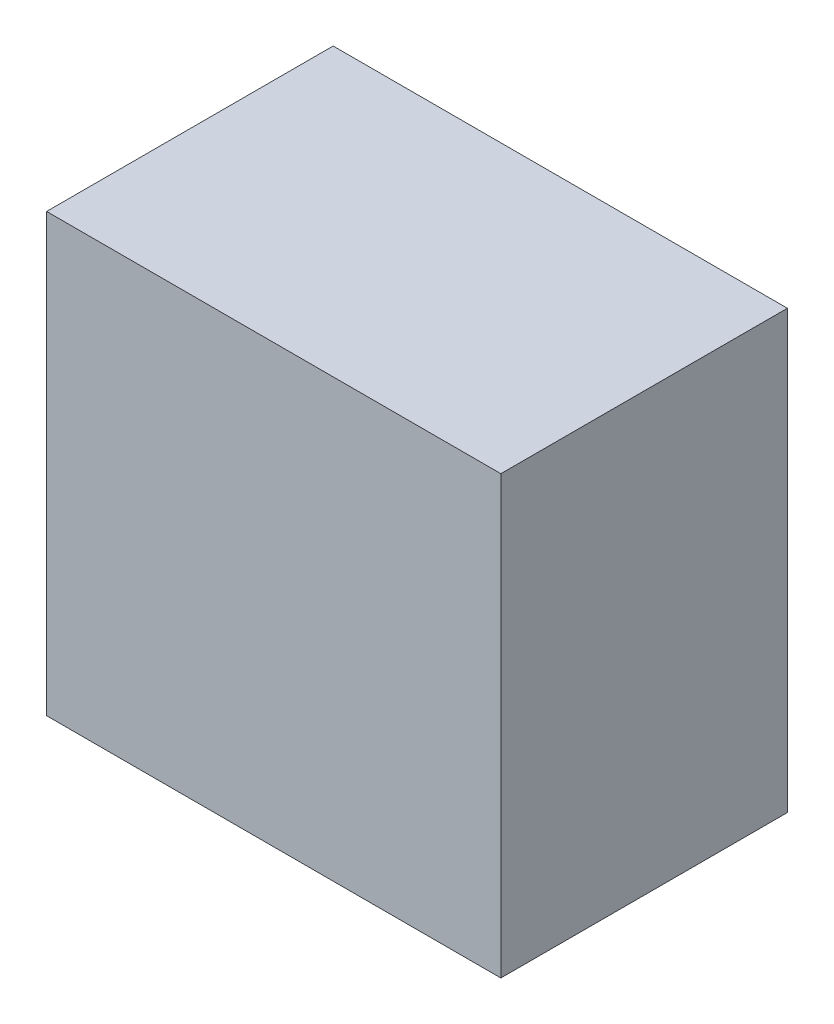
ISO-10303-21;
HEADER;
FILE_DESCRIPTION(('STEP AP214'),'2;1');
FILE_NAME('part.step','',(''),(''),'','','');
FILE_SCHEMA(('AUTOMOTIVE_DESIGN { 1 0 10303 214 1 1 1 1 }'));
ENDSEC;
DATA;
#1=APPLICATION_CONTEXT('core data for automotive mechanical design processes');
#2=APPLICATION_PROTOCOL_DEFINITION('international standard','automotive_design',2000,#1);
#3=PRODUCT_CONTEXT('',#1,'mechanical');
#4=PRODUCT('Part','Part','',(#3));
#5=PRODUCT_RELATED_PRODUCT_CATEGORY('part','',(#4));
#6=PRODUCT_DEFINITION_FORMATION('','',#4);
#7=PRODUCT_DEFINITION_CONTEXT('part definition',#1,'design');
#8=PRODUCT_DEFINITION('design','',#6,#7);
#9=PRODUCT_DEFINITION_SHAPE('','',#8);
#10=(LENGTH_UNIT() NAMED_UNIT(*) SI_UNIT(.MILLI.,.METRE.));
#11=(NAMED_UNIT(*) PLANE_ANGLE_UNIT() SI_UNIT($,.RADIAN.));
#12=(NAMED_UNIT(*) SI_UNIT($,.STERADIAN.) SOLID_ANGLE_UNIT());
#13=UNCERTAINTY_MEASURE_WITH_UNIT(LENGTH_MEASURE(1.E-05),#10,'distance_accuracy_value','');
#14=(GEOMETRIC_REPRESENTATION_CONTEXT(3) GLOBAL_UNCERTAINTY_ASSIGNED_CONTEXT((#13)) GLOBAL_UNIT_ASSIGNED_CONTEXT((#10,
#11,#12)) REPRESENTATION_CONTEXT('',''));
#15=CARTESIAN_POINT('',(0.,0.,0.));
#16=DIRECTION('',(0.,0.,1.));
#17=DIRECTION('',(1.,0.,0.));
#18=AXIS2_PLACEMENT_3D('',#15,#16,#17);
#19=CARTESIAN_POINT('',(0.,0.,20.));
#20=DIRECTION('',(1.,0.,0.));
#21=DIRECTION('',(0.,0.,-1.));
#22=AXIS2_PLACEMENT_3D('',#19,#20,#21);
#23=PLANE('',#22);
#24=DIRECTION('',(0.,-1.,0.));
#25=VECTOR('',#24,1.);
#26=CARTESIAN_POINT('',(0.,0.,0.));
#27=LINE('',#26,#25);
#28=CARTESIAN_POINT('',(0.,30.4850808468078,0.));
#29=VERTEX_POINT('',#28);
#30=CARTESIAN_POINT('',(0.,0.,0.));
#31=VERTEX_POINT('',#30);
#32=EDGE_CURVE('E111',#29,#31,#27,.T.);
#33=ORIENTED_EDGE('',*,*,#32,.T.);
#34=DIRECTION('',(0.,0.,-1.));
#35=VECTOR('',#34,1.);
#36=CARTESIAN_POINT('',(0.,0.,20.));
#37=LINE('',#36,#35);
#38=CARTESIAN_POINT('',(0.,0.,20.));
#39=VERTEX_POINT('',#38);
#40=EDGE_CURVE('E11',#39,#31,#37,.T.);
#41=ORIENTED_EDGE('',*,*,#40,.F.);
#42=DIRECTION('',(0.,-1.,0.));
#43=VECTOR('',#42,1.);
#44=CARTESIAN_POINT('',(0.,0.,20.));
#45=LINE('',#44,#43);
#46=CARTESIAN_POINT('',(0.,30.4850808468078,20.));
#47=VERTEX_POINT('',#46);
#48=EDGE_CURVE('E95',#47,#39,#45,.T.);
#49=ORIENTED_EDGE('',*,*,#48,.F.);
#50=DIRECTION('',(0.,0.,-1.));
#51=VECTOR('',#50,1.);
#52=CARTESIAN_POINT('',(0.,30.4850808468078,20.));
#53=LINE('',#52,#51);
#54=EDGE_CURVE('E107',#47,#29,#53,.T.);
#55=ORIENTED_EDGE('',*,*,#54,.T.);
#56=EDGE_LOOP('',(#33,#41,#49,#55));
#57=FACE_BOUND('',#56,.T.);
#58=ADVANCED_FACE('F43',(#57),#23,.F.);
#59=CARTESIAN_POINT('',(0.,0.,20.));
#60=DIRECTION('',(0.,1.,0.));
#61=DIRECTION('',(0.,0.,1.));
#62=AXIS2_PLACEMENT_3D('',#59,#60,#61);
#63=PLANE('',#62);
#64=DIRECTION('',(1.,0.,0.));
#65=VECTOR('',#64,1.);
#66=CARTESIAN_POINT('',(0.,0.,0.));
#67=LINE('',#66,#65);
#68=CARTESIAN_POINT('',(31.7044840806801,0.,0.));
#69=VERTEX_POINT('',#68);
#70=EDGE_CURVE('E100',#31,#69,#67,.T.);
#71=ORIENTED_EDGE('',*,*,#70,.T.);
#72=DIRECTION('',(0.,0.,-1.));
#73=VECTOR('',#72,1.);
#74=CARTESIAN_POINT('',(31.7044840806801,0.,20.));
#75=LINE('',#74,#73);
#76=CARTESIAN_POINT('',(31.7044840806801,0.,20.));
#77=VERTEX_POINT('',#76);
#78=EDGE_CURVE('E52',#77,#69,#75,.T.);
#79=ORIENTED_EDGE('',*,*,#78,.F.);
#80=DIRECTION('',(1.,0.,0.));
#81=VECTOR('',#80,1.);
#82=CARTESIAN_POINT('',(0.,0.,20.));
#83=LINE('',#82,#81);
#84=EDGE_CURVE('E90',#39,#77,#83,.T.);
#85=ORIENTED_EDGE('',*,*,#84,.F.);
#86=ORIENTED_EDGE('',*,*,#40,.T.);
#87=EDGE_LOOP('',(#71,#79,#85,#86));
#88=FACE_BOUND('',#87,.T.);
#89=ADVANCED_FACE('F99',(#88),#63,.F.);
#90=CARTESIAN_POINT('',(31.7044840806801,0.,20.));
#91=DIRECTION('',(-1.,0.,0.));
#92=DIRECTION('',(0.,0.,1.));
#93=AXIS2_PLACEMENT_3D('',#90,#91,#92);
#94=PLANE('',#93);
#95=DIRECTION('',(0.,1.,0.));
#96=VECTOR('',#95,1.);
#97=CARTESIAN_POINT('',(31.7044840806801,0.,0.));
#98=LINE('',#97,#96);
#99=CARTESIAN_POINT('',(31.7044840806801,30.4850808468078,0.));
#100=VERTEX_POINT('',#99);
#101=EDGE_CURVE('E77',#69,#100,#98,.T.);
#102=ORIENTED_EDGE('',*,*,#101,.T.);
#103=DIRECTION('',(0.,0.,-1.));
#104=VECTOR('',#103,1.);
#105=CARTESIAN_POINT('',(31.7044840806801,30.4850808468078,20.));
#106=LINE('',#105,#104);
#107=CARTESIAN_POINT('',(31.7044840806801,30.4850808468078,20.));
#108=VERTEX_POINT('',#107);
#109=EDGE_CURVE('E102',#108,#100,#106,.T.);
#110=ORIENTED_EDGE('',*,*,#109,.F.);
#111=DIRECTION('',(0.,1.,0.));
#112=VECTOR('',#111,1.);
#113=CARTESIAN_POINT('',(31.7044840806801,0.,20.));
#114=LINE('',#113,#112);
#115=EDGE_CURVE('E93',#77,#108,#114,.T.);
#116=ORIENTED_EDGE('',*,*,#115,.F.);
#117=ORIENTED_EDGE('',*,*,#78,.T.);
#118=EDGE_LOOP('',(#102,#110,#116,#117));
#119=FACE_BOUND('',#118,.T.);
#120=ADVANCED_FACE('F103',(#119),#94,.F.);
#121=CARTESIAN_POINT('',(0.,30.4850808468078,20.));
#122=DIRECTION('',(0.,-1.,0.));
#123=DIRECTION('',(0.,0.,-1.));
#124=AXIS2_PLACEMENT_3D('',#121,#122,#123);
#125=PLANE('',#124);
#126=DIRECTION('',(-1.,0.,0.));
#127=VECTOR('',#126,1.);
#128=CARTESIAN_POINT('',(0.,30.4850808468078,0.));
#129=LINE('',#128,#127);
#130=EDGE_CURVE('E83',#100,#29,#129,.T.);
#131=ORIENTED_EDGE('',*,*,#130,.T.);
#132=ORIENTED_EDGE('',*,*,#54,.F.);
#133=DIRECTION('',(-1.,0.,0.));
#134=VECTOR('',#133,1.);
#135=CARTESIAN_POINT('',(0.,30.4850808468078,20.));
#136=LINE('',#135,#134);
#137=EDGE_CURVE('E60',#108,#47,#136,.T.);
#138=ORIENTED_EDGE('',*,*,#137,.F.);
#139=ORIENTED_EDGE('',*,*,#109,.T.);
#140=EDGE_LOOP('',(#131,#132,#138,#139));
#141=FACE_BOUND('',#140,.T.);
#142=ADVANCED_FACE('F124',(#141),#125,.F.);
#143=CARTESIAN_POINT('',(0.,0.,20.));
#144=DIRECTION('',(0.,0.,-1.));
#145=DIRECTION('',(-1.,0.,0.));
#146=AXIS2_PLACEMENT_3D('',#143,#144,#145);
#147=PLANE('',#146);
#148=ORIENTED_EDGE('',*,*,#48,.T.);
#149=ORIENTED_EDGE('',*,*,#84,.T.);
#150=ORIENTED_EDGE('',*,*,#115,.T.);
#151=ORIENTED_EDGE('',*,*,#137,.T.);
#152=EDGE_LOOP('',(#148,#149,#150,#151));
#153=FACE_BOUND('',#152,.T.);
#154=ADVANCED_FACE('F91',(#153),#147,.F.);
#155=CARTESIAN_POINT('',(0.,0.,0.));
#156=DIRECTION('',(0.,0.,-1.));
#157=DIRECTION('',(-1.,0.,0.));
#158=AXIS2_PLACEMENT_3D('',#155,#156,#157);
#159=PLANE('',#158);
#160=ORIENTED_EDGE('',*,*,#32,.F.);
#161=ORIENTED_EDGE('',*,*,#130,.F.);
#162=ORIENTED_EDGE('',*,*,#101,.F.);
#163=ORIENTED_EDGE('',*,*,#70,.F.);
#164=EDGE_LOOP('',(#160,#161,#162,#163));
#165=FACE_BOUND('',#164,.T.);
#166=ADVANCED_FACE('F127',(#165),#159,.T.);
#167=CLOSED_SHELL('',(#58,#89,#120,#142,#154,#166));
#168=MANIFOLD_SOLID_BREP('B2',#167);
#169=ADVANCED_BREP_SHAPE_REPRESENTATION('',(#18,#168),#14);
#170=SHAPE_DEFINITION_REPRESENTATION(#9,#169);
ENDSEC;
END-ISO-10303-21;
